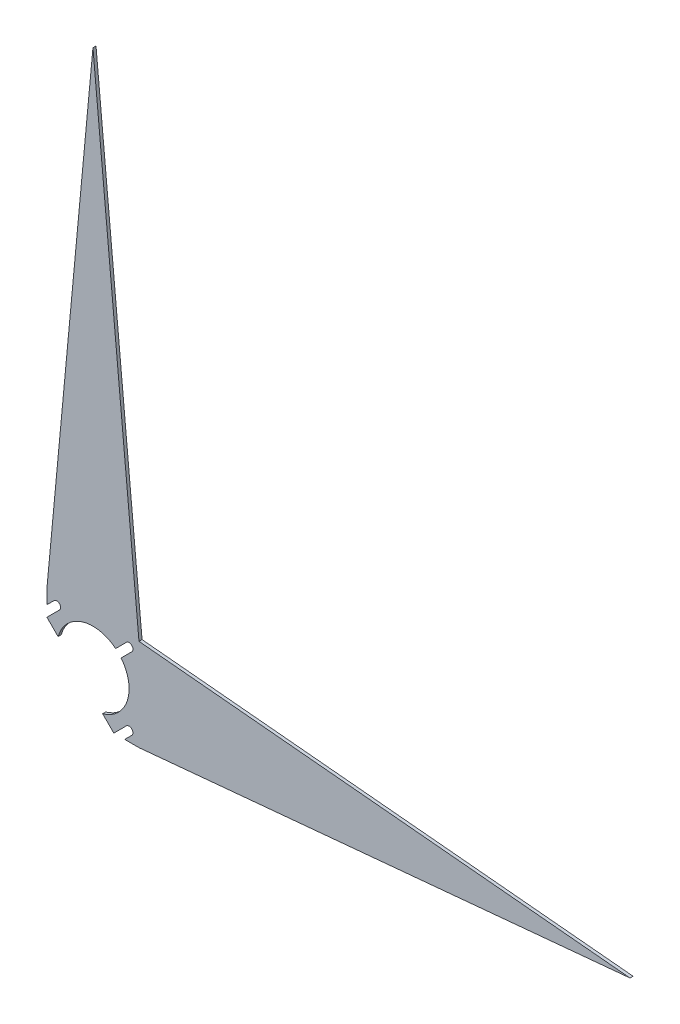
ISO-10303-21;
HEADER;
FILE_DESCRIPTION(('STEP AP214'),'2;1');
FILE_NAME('part.step','',(''),(''),'','','');
FILE_SCHEMA(('AUTOMOTIVE_DESIGN { 1 0 10303 214 1 1 1 1 }'));
ENDSEC;
DATA;
#1=APPLICATION_CONTEXT('core data for automotive mechanical design processes');
#2=APPLICATION_PROTOCOL_DEFINITION('international standard','automotive_design',2000,#1);
#3=PRODUCT_CONTEXT('',#1,'mechanical');
#4=PRODUCT('Part','Part','',(#3));
#5=PRODUCT_RELATED_PRODUCT_CATEGORY('part','',(#4));
#6=PRODUCT_DEFINITION_FORMATION('','',#4);
#7=PRODUCT_DEFINITION_CONTEXT('part definition',#1,'design');
#8=PRODUCT_DEFINITION('design','',#6,#7);
#9=PRODUCT_DEFINITION_SHAPE('','',#8);
#10=(LENGTH_UNIT() NAMED_UNIT(*) SI_UNIT(.MILLI.,.METRE.));
#11=(NAMED_UNIT(*) PLANE_ANGLE_UNIT() SI_UNIT($,.RADIAN.));
#12=(NAMED_UNIT(*) SI_UNIT($,.STERADIAN.) SOLID_ANGLE_UNIT());
#13=UNCERTAINTY_MEASURE_WITH_UNIT(LENGTH_MEASURE(1.E-05),#10,'distance_accuracy_value','');
#14=(GEOMETRIC_REPRESENTATION_CONTEXT(3) GLOBAL_UNCERTAINTY_ASSIGNED_CONTEXT((#13)) GLOBAL_UNIT_ASSIGNED_CONTEXT((#10,
#11,#12)) REPRESENTATION_CONTEXT('',''));
#15=CARTESIAN_POINT('',(0.,0.,0.));
#16=DIRECTION('',(0.,0.,1.));
#17=DIRECTION('',(1.,0.,0.));
#18=AXIS2_PLACEMENT_3D('',#15,#16,#17);
#19=CARTESIAN_POINT('',(23.57,-23.57,2.));
#20=DIRECTION('',(0.,0.,-1.));
#21=DIRECTION('',(-1.,0.,0.));
#22=AXIS2_PLACEMENT_3D('',#19,#20,#21);
#23=CYLINDRICAL_SURFACE('',#22,23.57);
#24=DIRECTION('',(0.,0.,-1.));
#25=VECTOR('',#24,1.);
#26=CARTESIAN_POINT('',(41.9102577132595,-8.76527619267332,2.));
#27=LINE('',#26,#25);
#28=CARTESIAN_POINT('',(41.9102577132595,-8.76527619267332,0.));
#29=VERTEX_POINT('',#28);
#30=CARTESIAN_POINT('',(41.9102577132595,-8.76527619267332,2.));
#31=VERTEX_POINT('',#30);
#32=EDGE_CURVE('E11',#29,#31,#27,.F.);
#33=ORIENTED_EDGE('',*,*,#32,.F.);
#34=CARTESIAN_POINT('',(23.57,-23.57,0.));
#35=DIRECTION('',(0.,0.,1.));
#36=DIRECTION('',(1.,0.,0.));
#37=AXIS2_PLACEMENT_3D('',#34,#35,#36);
#38=CIRCLE('',#37,23.57);
#39=CARTESIAN_POINT('',(29.8832311858542,-46.2787650917869,0.));
#40=VERTEX_POINT('',#39);
#41=EDGE_CURVE('E294',#40,#29,#38,.T.);
#42=ORIENTED_EDGE('',*,*,#41,.F.);
#43=DIRECTION('',(0.,0.,-1.));
#44=VECTOR('',#43,1.);
#45=CARTESIAN_POINT('',(29.8832311858542,-46.2787650917869,2.));
#46=LINE('',#45,#44);
#47=CARTESIAN_POINT('',(29.8832311858542,-46.2787650917869,2.));
#48=VERTEX_POINT('',#47);
#49=EDGE_CURVE('E278',#48,#40,#46,.T.);
#50=ORIENTED_EDGE('',*,*,#49,.F.);
#51=CARTESIAN_POINT('',(23.57,-23.57,2.));
#52=DIRECTION('',(0.,0.,1.));
#53=DIRECTION('',(1.,0.,0.));
#54=AXIS2_PLACEMENT_3D('',#51,#52,#53);
#55=CIRCLE('',#54,23.57);
#56=EDGE_CURVE('E308',#48,#31,#55,.T.);
#57=ORIENTED_EDGE('',*,*,#56,.T.);
#58=EDGE_LOOP('',(#33,#42,#50,#57));
#59=FACE_BOUND('',#58,.T.);
#60=ADVANCED_FACE('F38',(#59),#23,.F.);
#61=CARTESIAN_POINT('',(0.,0.,2.));
#62=DIRECTION('',(0.,0.,1.));
#63=DIRECTION('',(1.,0.,0.));
#64=AXIS2_PLACEMENT_3D('',#61,#62,#63);
#65=PLANE('',#64);
#66=DIRECTION('',(0.707106781186543,0.707106781186552,0.));
#67=VECTOR('',#66,1.);
#68=CARTESIAN_POINT('',(48.9077669529664,-1.76776695296636,2.));
#69=LINE('',#68,#67);
#70=CARTESIAN_POINT('',(48.9077669529664,-1.76776695296636,2.));
#71=VERTEX_POINT('',#70);
#72=EDGE_CURVE('E180',#31,#71,#69,.T.);
#73=ORIENTED_EDGE('',*,*,#72,.F.);
#74=ORIENTED_EDGE('',*,*,#56,.F.);
#75=DIRECTION('',(-0.707106781186547,0.707106781186548,0.));
#76=VECTOR('',#75,1.);
#77=CARTESIAN_POINT('',(-6.42999999999999,-9.96553390593272,2.));
#78=LINE('',#77,#76);
#79=CARTESIAN_POINT('',(37.1744660940673,-53.57,2.));
#80=VERTEX_POINT('',#79);
#81=EDGE_CURVE('E289',#80,#48,#78,.T.);
#82=ORIENTED_EDGE('',*,*,#81,.F.);
#83=DIRECTION('',(-0.707106781186549,-0.707106781186546,0.));
#84=VECTOR('',#83,1.);
#85=CARTESIAN_POINT('',(37.1744660940673,-53.57,2.));
#86=LINE('',#85,#84);
#87=CARTESIAN_POINT('',(45.3722330470337,-45.3722330470336,2.));
#88=VERTEX_POINT('',#87);
#89=EDGE_CURVE('E356',#88,#80,#86,.T.);
#90=ORIENTED_EDGE('',*,*,#89,.F.);
#91=CARTESIAN_POINT('',(47.14,-47.14,2.));
#92=DIRECTION('',(0.,0.,1.));
#93=DIRECTION('',(1.,0.,0.));
#94=AXIS2_PLACEMENT_3D('',#91,#92,#93);
#95=CIRCLE('',#94,2.5);
#96=CARTESIAN_POINT('',(48.9077669529664,-48.9077669529664,2.));
#97=VERTEX_POINT('',#96);
#98=EDGE_CURVE('E197',#97,#88,#95,.T.);
#99=ORIENTED_EDGE('',*,*,#98,.F.);
#100=DIRECTION('',(0.707106781186548,0.707106781186547,0.));
#101=VECTOR('',#100,1.);
#102=CARTESIAN_POINT('',(48.9077669529664,-48.9077669529664,2.));
#103=LINE('',#102,#101);
#104=CARTESIAN_POINT('',(44.2455339059328,-53.57,2.));
#105=VERTEX_POINT('',#104);
#106=EDGE_CURVE('E62',#105,#97,#103,.T.);
#107=ORIENTED_EDGE('',*,*,#106,.F.);
#108=DIRECTION('',(1.,0.,0.));
#109=VECTOR('',#108,1.);
#110=CARTESIAN_POINT('',(-6.42999999999999,-53.57,2.));
#111=LINE('',#110,#109);
#112=CARTESIAN_POINT('',(53.57,-53.57,2.));
#113=VERTEX_POINT('',#112);
#114=EDGE_CURVE('E231',#105,#113,#111,.T.);
#115=ORIENTED_EDGE('',*,*,#114,.T.);
#116=DIRECTION('',(0.995634226059288,0.0933407086930583,0.));
#117=VECTOR('',#116,1.);
#118=CARTESIAN_POINT('',(53.57,-53.57,2.));
#119=LINE('',#118,#117);
#120=CARTESIAN_POINT('',(373.57,-23.57,2.));
#121=VERTEX_POINT('',#120);
#122=EDGE_CURVE('E234',#113,#121,#119,.T.);
#123=ORIENTED_EDGE('',*,*,#122,.T.);
#124=DIRECTION('',(-0.995634226059288,0.0933407086930583,0.));
#125=VECTOR('',#124,1.);
#126=CARTESIAN_POINT('',(373.57,-23.57,2.));
#127=LINE('',#126,#125);
#128=CARTESIAN_POINT('',(53.57,6.43,2.));
#129=VERTEX_POINT('',#128);
#130=EDGE_CURVE('E216',#121,#129,#127,.T.);
#131=ORIENTED_EDGE('',*,*,#130,.T.);
#132=DIRECTION('',(-0.0933407086930583,0.995634226059288,0.));
#133=VECTOR('',#132,1.);
#134=CARTESIAN_POINT('',(53.57,6.43,2.));
#135=LINE('',#134,#133);
#136=CARTESIAN_POINT('',(23.57,326.43,2.));
#137=VERTEX_POINT('',#136);
#138=EDGE_CURVE('E220',#129,#137,#135,.T.);
#139=ORIENTED_EDGE('',*,*,#138,.T.);
#140=DIRECTION('',(-0.0933407086930582,-0.995634226059288,0.));
#141=VECTOR('',#140,1.);
#142=CARTESIAN_POINT('',(23.57,326.43,2.));
#143=LINE('',#142,#141);
#144=CARTESIAN_POINT('',(-6.42999999999999,6.43,2.));
#145=VERTEX_POINT('',#144);
#146=EDGE_CURVE('E224',#137,#145,#143,.T.);
#147=ORIENTED_EDGE('',*,*,#146,.T.);
#148=DIRECTION('',(0.,-1.,0.));
#149=VECTOR('',#148,1.);
#150=CARTESIAN_POINT('',(-6.42999999999999,-53.57,2.));
#151=LINE('',#150,#149);
#152=CARTESIAN_POINT('',(-6.42999999999999,-2.89446609406724,2.));
#153=VERTEX_POINT('',#152);
#154=EDGE_CURVE('E227',#145,#153,#151,.T.);
#155=ORIENTED_EDGE('',*,*,#154,.T.);
#156=DIRECTION('',(-0.707106781186547,-0.707106781186548,0.));
#157=VECTOR('',#156,1.);
#158=CARTESIAN_POINT('',(-1.76776695296637,1.76776695296637,2.));
#159=LINE('',#158,#157);
#160=CARTESIAN_POINT('',(-1.76776695296637,1.76776695296637,2.));
#161=VERTEX_POINT('',#160);
#162=EDGE_CURVE('E351',#161,#153,#159,.T.);
#163=ORIENTED_EDGE('',*,*,#162,.F.);
#164=CARTESIAN_POINT('',(0.,0.,2.));
#165=DIRECTION('',(0.,0.,1.));
#166=DIRECTION('',(1.,0.,0.));
#167=AXIS2_PLACEMENT_3D('',#164,#165,#166);
#168=CIRCLE('',#167,2.5);
#169=CARTESIAN_POINT('',(1.76776695296637,-1.76776695296637,2.));
#170=VERTEX_POINT('',#169);
#171=EDGE_CURVE('E208',#170,#161,#168,.T.);
#172=ORIENTED_EDGE('',*,*,#171,.F.);
#173=DIRECTION('',(0.707106781186548,0.707106781186547,0.));
#174=VECTOR('',#173,1.);
#175=CARTESIAN_POINT('',(-6.42999999999999,-9.96553390593272,2.));
#176=LINE('',#175,#174);
#177=CARTESIAN_POINT('',(-6.42999999999999,-9.96553390593272,2.));
#178=VERTEX_POINT('',#177);
#179=EDGE_CURVE('E336',#178,#170,#176,.T.);
#180=ORIENTED_EDGE('',*,*,#179,.F.);
#181=CARTESIAN_POINT('',(0.861234908213125,-17.2567688141458,2.));
#182=VERTEX_POINT('',#181);
#183=EDGE_CURVE('E360',#182,#178,#78,.T.);
#184=ORIENTED_EDGE('',*,*,#183,.F.);
#185=CARTESIAN_POINT('',(38.3747238073266,-5.22974228674045,2.));
#186=VERTEX_POINT('',#185);
#187=EDGE_CURVE('E314',#186,#182,#55,.T.);
#188=ORIENTED_EDGE('',*,*,#187,.F.);
#189=DIRECTION('',(-0.707106781186556,-0.707106781186539,0.));
#190=VECTOR('',#189,1.);
#191=CARTESIAN_POINT('',(45.3722330470337,1.76776695296639,2.));
#192=LINE('',#191,#190);
#193=CARTESIAN_POINT('',(45.3722330470337,1.76776695296639,2.));
#194=VERTEX_POINT('',#193);
#195=EDGE_CURVE('E329',#194,#186,#192,.T.);
#196=ORIENTED_EDGE('',*,*,#195,.F.);
#197=CARTESIAN_POINT('',(47.14,0.,2.));
#198=DIRECTION('',(0.,0.,1.));
#199=DIRECTION('',(1.,0.,0.));
#200=AXIS2_PLACEMENT_3D('',#197,#198,#199);
#201=CIRCLE('',#200,2.5);
#202=EDGE_CURVE('E189',#71,#194,#201,.T.);
#203=ORIENTED_EDGE('',*,*,#202,.F.);
#204=EDGE_LOOP('',(#73,#74,#82,#90,#99,#107,#115,#123,#131,#139,#147,#155,#163,#172,#180,#184,
#188,#196,#203));
#205=FACE_BOUND('',#204,.T.);
#206=ADVANCED_FACE('F325',(#205),#65,.T.);
#207=CARTESIAN_POINT('',(0.,0.,0.));
#208=DIRECTION('',(0.,0.,1.));
#209=DIRECTION('',(1.,0.,0.));
#210=AXIS2_PLACEMENT_3D('',#207,#208,#209);
#211=PLANE('',#210);
#212=ORIENTED_EDGE('',*,*,#41,.T.);
#213=DIRECTION('',(0.707106781186543,0.707106781186552,0.));
#214=VECTOR('',#213,1.);
#215=CARTESIAN_POINT('',(48.9077669529664,-1.76776695296636,0.));
#216=LINE('',#215,#214);
#217=CARTESIAN_POINT('',(48.9077669529664,-1.76776695296636,0.));
#218=VERTEX_POINT('',#217);
#219=EDGE_CURVE('E179',#29,#218,#216,.T.);
#220=ORIENTED_EDGE('',*,*,#219,.T.);
#221=CARTESIAN_POINT('',(47.14,0.,0.));
#222=DIRECTION('',(0.,0.,1.));
#223=DIRECTION('',(1.,0.,0.));
#224=AXIS2_PLACEMENT_3D('',#221,#222,#223);
#225=CIRCLE('',#224,2.5);
#226=CARTESIAN_POINT('',(45.3722330470337,1.76776695296639,0.));
#227=VERTEX_POINT('',#226);
#228=EDGE_CURVE('E187',#218,#227,#225,.T.);
#229=ORIENTED_EDGE('',*,*,#228,.T.);
#230=DIRECTION('',(-0.707106781186556,-0.707106781186539,0.));
#231=VECTOR('',#230,1.);
#232=CARTESIAN_POINT('',(45.3722330470337,1.76776695296639,0.));
#233=LINE('',#232,#231);
#234=CARTESIAN_POINT('',(38.3747238073266,-5.22974228674045,0.));
#235=VERTEX_POINT('',#234);
#236=EDGE_CURVE('E168',#227,#235,#233,.T.);
#237=ORIENTED_EDGE('',*,*,#236,.T.);
#238=CARTESIAN_POINT('',(0.861234908213125,-17.2567688141458,0.));
#239=VERTEX_POINT('',#238);
#240=EDGE_CURVE('E303',#235,#239,#38,.T.);
#241=ORIENTED_EDGE('',*,*,#240,.T.);
#242=DIRECTION('',(-0.707106781186547,0.707106781186548,0.));
#243=VECTOR('',#242,1.);
#244=CARTESIAN_POINT('',(-6.42999999999999,-9.96553390593272,0.));
#245=LINE('',#244,#243);
#246=CARTESIAN_POINT('',(-6.42999999999999,-9.96553390593272,0.));
#247=VERTEX_POINT('',#246);
#248=EDGE_CURVE('E299',#239,#247,#245,.T.);
#249=ORIENTED_EDGE('',*,*,#248,.T.);
#250=DIRECTION('',(0.707106781186548,0.707106781186547,0.));
#251=VECTOR('',#250,1.);
#252=CARTESIAN_POINT('',(-6.42999999999999,-9.96553390593272,0.));
#253=LINE('',#252,#251);
#254=CARTESIAN_POINT('',(1.76776695296637,-1.76776695296637,0.));
#255=VERTEX_POINT('',#254);
#256=EDGE_CURVE('E338',#247,#255,#253,.T.);
#257=ORIENTED_EDGE('',*,*,#256,.T.);
#258=CARTESIAN_POINT('',(0.,0.,0.));
#259=DIRECTION('',(0.,0.,1.));
#260=DIRECTION('',(1.,0.,0.));
#261=AXIS2_PLACEMENT_3D('',#258,#259,#260);
#262=CIRCLE('',#261,2.5);
#263=CARTESIAN_POINT('',(-1.76776695296637,1.76776695296637,0.));
#264=VERTEX_POINT('',#263);
#265=EDGE_CURVE('E201',#255,#264,#262,.T.);
#266=ORIENTED_EDGE('',*,*,#265,.T.);
#267=DIRECTION('',(-0.707106781186547,-0.707106781186548,0.));
#268=VECTOR('',#267,1.);
#269=CARTESIAN_POINT('',(-1.76776695296637,1.76776695296637,0.));
#270=LINE('',#269,#268);
#271=CARTESIAN_POINT('',(-6.42999999999999,-2.89446609406724,0.));
#272=VERTEX_POINT('',#271);
#273=EDGE_CURVE('E54',#264,#272,#270,.T.);
#274=ORIENTED_EDGE('',*,*,#273,.T.);
#275=DIRECTION('',(0.,-1.,0.));
#276=VECTOR('',#275,1.);
#277=CARTESIAN_POINT('',(-6.42999999999999,-53.57,0.));
#278=LINE('',#277,#276);
#279=CARTESIAN_POINT('',(-6.42999999999999,6.43,0.));
#280=VERTEX_POINT('',#279);
#281=EDGE_CURVE('E247',#280,#272,#278,.T.);
#282=ORIENTED_EDGE('',*,*,#281,.F.);
#283=DIRECTION('',(-0.0933407086930582,-0.995634226059288,0.));
#284=VECTOR('',#283,1.);
#285=CARTESIAN_POINT('',(23.57,326.43,0.));
#286=LINE('',#285,#284);
#287=CARTESIAN_POINT('',(23.57,326.43,0.));
#288=VERTEX_POINT('',#287);
#289=EDGE_CURVE('E244',#288,#280,#286,.T.);
#290=ORIENTED_EDGE('',*,*,#289,.F.);
#291=DIRECTION('',(-0.0933407086930583,0.995634226059288,0.));
#292=VECTOR('',#291,1.);
#293=CARTESIAN_POINT('',(53.57,6.43,0.));
#294=LINE('',#293,#292);
#295=CARTESIAN_POINT('',(53.57,6.43,0.));
#296=VERTEX_POINT('',#295);
#297=EDGE_CURVE('E241',#296,#288,#294,.T.);
#298=ORIENTED_EDGE('',*,*,#297,.F.);
#299=DIRECTION('',(-0.995634226059288,0.0933407086930583,0.));
#300=VECTOR('',#299,1.);
#301=CARTESIAN_POINT('',(373.57,-23.57,0.));
#302=LINE('',#301,#300);
#303=CARTESIAN_POINT('',(373.57,-23.57,0.));
#304=VERTEX_POINT('',#303);
#305=EDGE_CURVE('E212',#304,#296,#302,.T.);
#306=ORIENTED_EDGE('',*,*,#305,.F.);
#307=DIRECTION('',(0.995634226059288,0.0933407086930583,0.));
#308=VECTOR('',#307,1.);
#309=CARTESIAN_POINT('',(53.57,-53.57,0.));
#310=LINE('',#309,#308);
#311=CARTESIAN_POINT('',(53.57,-53.57,0.));
#312=VERTEX_POINT('',#311);
#313=EDGE_CURVE('E221',#312,#304,#310,.T.);
#314=ORIENTED_EDGE('',*,*,#313,.F.);
#315=DIRECTION('',(1.,0.,0.));
#316=VECTOR('',#315,1.);
#317=CARTESIAN_POINT('',(-6.42999999999999,-53.57,0.));
#318=LINE('',#317,#316);
#319=CARTESIAN_POINT('',(44.2455339059328,-53.57,0.));
#320=VERTEX_POINT('',#319);
#321=EDGE_CURVE('E251',#320,#312,#318,.T.);
#322=ORIENTED_EDGE('',*,*,#321,.F.);
#323=DIRECTION('',(0.707106781186548,0.707106781186547,0.));
#324=VECTOR('',#323,1.);
#325=CARTESIAN_POINT('',(48.9077669529664,-48.9077669529664,0.));
#326=LINE('',#325,#324);
#327=CARTESIAN_POINT('',(48.9077669529664,-48.9077669529664,0.));
#328=VERTEX_POINT('',#327);
#329=EDGE_CURVE('E344',#320,#328,#326,.T.);
#330=ORIENTED_EDGE('',*,*,#329,.T.);
#331=CARTESIAN_POINT('',(47.14,-47.14,0.));
#332=DIRECTION('',(0.,0.,1.));
#333=DIRECTION('',(1.,0.,0.));
#334=AXIS2_PLACEMENT_3D('',#331,#332,#333);
#335=CIRCLE('',#334,2.5);
#336=CARTESIAN_POINT('',(45.3722330470337,-45.3722330470336,0.));
#337=VERTEX_POINT('',#336);
#338=EDGE_CURVE('E204',#328,#337,#335,.T.);
#339=ORIENTED_EDGE('',*,*,#338,.T.);
#340=DIRECTION('',(-0.707106781186549,-0.707106781186546,0.));
#341=VECTOR('',#340,1.);
#342=CARTESIAN_POINT('',(37.1744660940673,-53.57,0.));
#343=LINE('',#342,#341);
#344=CARTESIAN_POINT('',(37.1744660940673,-53.57,0.));
#345=VERTEX_POINT('',#344);
#346=EDGE_CURVE('E296',#337,#345,#343,.T.);
#347=ORIENTED_EDGE('',*,*,#346,.T.);
#348=EDGE_CURVE('E286',#345,#40,#245,.T.);
#349=ORIENTED_EDGE('',*,*,#348,.T.);
#350=EDGE_LOOP('',(#212,#220,#229,#237,#241,#249,#257,#266,#274,#282,#290,#298,#306,#314,#322,
#330,#339,#347,#349));
#351=FACE_BOUND('',#350,.T.);
#352=ADVANCED_FACE('F195',(#351),#211,.F.);
#353=CARTESIAN_POINT('',(373.57,-23.57,2.));
#354=DIRECTION('',(-0.0933407086930583,-0.995634226059288,0.));
#355=DIRECTION('',(0.995634226059288,-0.0933407086930583,0.));
#356=AXIS2_PLACEMENT_3D('',#353,#354,#355);
#357=PLANE('',#356);
#358=ORIENTED_EDGE('',*,*,#305,.T.);
#359=DIRECTION('',(0.,0.,-1.));
#360=VECTOR('',#359,1.);
#361=CARTESIAN_POINT('',(53.57,6.43,2.));
#362=LINE('',#361,#360);
#363=EDGE_CURVE('E271',#129,#296,#362,.T.);
#364=ORIENTED_EDGE('',*,*,#363,.F.);
#365=ORIENTED_EDGE('',*,*,#130,.F.);
#366=DIRECTION('',(0.,0.,-1.));
#367=VECTOR('',#366,1.);
#368=CARTESIAN_POINT('',(373.57,-23.57,2.));
#369=LINE('',#368,#367);
#370=EDGE_CURVE('E237',#121,#304,#369,.T.);
#371=ORIENTED_EDGE('',*,*,#370,.T.);
#372=EDGE_LOOP('',(#358,#364,#365,#371));
#373=FACE_BOUND('',#372,.T.);
#374=ADVANCED_FACE('F40',(#373),#357,.F.);
#375=CARTESIAN_POINT('',(53.57,6.43,2.));
#376=DIRECTION('',(-0.995634226059288,-0.0933407086930583,0.));
#377=DIRECTION('',(0.0933407086930583,-0.995634226059288,0.));
#378=AXIS2_PLACEMENT_3D('',#375,#376,#377);
#379=PLANE('',#378);
#380=ORIENTED_EDGE('',*,*,#297,.T.);
#381=DIRECTION('',(0.,0.,-1.));
#382=VECTOR('',#381,1.);
#383=CARTESIAN_POINT('',(23.57,326.43,2.));
#384=LINE('',#383,#382);
#385=EDGE_CURVE('E267',#137,#288,#384,.T.);
#386=ORIENTED_EDGE('',*,*,#385,.F.);
#387=ORIENTED_EDGE('',*,*,#138,.F.);
#388=ORIENTED_EDGE('',*,*,#363,.T.);
#389=EDGE_LOOP('',(#380,#386,#387,#388));
#390=FACE_BOUND('',#389,.T.);
#391=ADVANCED_FACE('F458',(#390),#379,.F.);
#392=CARTESIAN_POINT('',(23.57,326.43,2.));
#393=DIRECTION('',(0.995634226059288,-0.0933407086930583,0.));
#394=DIRECTION('',(0.0933407086930582,0.995634226059288,0.));
#395=AXIS2_PLACEMENT_3D('',#392,#393,#394);
#396=PLANE('',#395);
#397=ORIENTED_EDGE('',*,*,#289,.T.);
#398=DIRECTION('',(0.,0.,-1.));
#399=VECTOR('',#398,1.);
#400=CARTESIAN_POINT('',(-6.42999999999999,6.43,2.));
#401=LINE('',#400,#399);
#402=EDGE_CURVE('E263',#145,#280,#401,.T.);
#403=ORIENTED_EDGE('',*,*,#402,.F.);
#404=ORIENTED_EDGE('',*,*,#146,.F.);
#405=ORIENTED_EDGE('',*,*,#385,.T.);
#406=EDGE_LOOP('',(#397,#403,#404,#405));
#407=FACE_BOUND('',#406,.T.);
#408=ADVANCED_FACE('F455',(#407),#396,.F.);
#409=CARTESIAN_POINT('',(-6.42999999999999,-53.57,2.));
#410=DIRECTION('',(1.,0.,0.));
#411=DIRECTION('',(0.,0.,-1.));
#412=AXIS2_PLACEMENT_3D('',#409,#410,#411);
#413=PLANE('',#412);
#414=ORIENTED_EDGE('',*,*,#281,.T.);
#415=DIRECTION('',(0.,0.,1.));
#416=VECTOR('',#415,1.);
#417=CARTESIAN_POINT('',(-6.42999999999999,-2.89446609406725,2.));
#418=LINE('',#417,#416);
#419=EDGE_CURVE('E304',#272,#153,#418,.T.);
#420=ORIENTED_EDGE('',*,*,#419,.T.);
#421=ORIENTED_EDGE('',*,*,#154,.F.);
#422=ORIENTED_EDGE('',*,*,#402,.T.);
#423=EDGE_LOOP('',(#414,#420,#421,#422));
#424=FACE_BOUND('',#423,.T.);
#425=ADVANCED_FACE('F450',(#424),#413,.F.);
#426=CARTESIAN_POINT('',(-6.42999999999999,-53.57,2.));
#427=DIRECTION('',(0.,1.,0.));
#428=DIRECTION('',(0.,0.,1.));
#429=AXIS2_PLACEMENT_3D('',#426,#427,#428);
#430=PLANE('',#429);
#431=ORIENTED_EDGE('',*,*,#114,.F.);
#432=DIRECTION('',(0.,0.,-1.));
#433=VECTOR('',#432,1.);
#434=CARTESIAN_POINT('',(44.2455339059327,-53.57,2.));
#435=LINE('',#434,#433);
#436=EDGE_CURVE('E310',#105,#320,#435,.T.);
#437=ORIENTED_EDGE('',*,*,#436,.T.);
#438=ORIENTED_EDGE('',*,*,#321,.T.);
#439=DIRECTION('',(0.,0.,-1.));
#440=VECTOR('',#439,1.);
#441=CARTESIAN_POINT('',(53.57,-53.57,2.));
#442=LINE('',#441,#440);
#443=EDGE_CURVE('E259',#113,#312,#442,.T.);
#444=ORIENTED_EDGE('',*,*,#443,.F.);
#445=EDGE_LOOP('',(#431,#437,#438,#444));
#446=FACE_BOUND('',#445,.T.);
#447=ADVANCED_FACE('F387',(#446),#430,.F.);
#448=CARTESIAN_POINT('',(53.57,-53.57,2.));
#449=DIRECTION('',(-0.0933407086930583,0.995634226059288,0.));
#450=DIRECTION('',(-0.995634226059288,-0.0933407086930583,0.));
#451=AXIS2_PLACEMENT_3D('',#448,#449,#450);
#452=PLANE('',#451);
#453=ORIENTED_EDGE('',*,*,#313,.T.);
#454=ORIENTED_EDGE('',*,*,#370,.F.);
#455=ORIENTED_EDGE('',*,*,#122,.F.);
#456=ORIENTED_EDGE('',*,*,#443,.T.);
#457=EDGE_LOOP('',(#453,#454,#455,#456));
#458=FACE_BOUND('',#457,.T.);
#459=ADVANCED_FACE('F393',(#458),#452,.F.);
#460=CARTESIAN_POINT('',(0.,0.,2.));
#461=DIRECTION('',(0.,0.,-1.));
#462=DIRECTION('',(-1.,0.,0.));
#463=AXIS2_PLACEMENT_3D('',#460,#461,#462);
#464=CYLINDRICAL_SURFACE('',#463,2.5);
#465=DIRECTION('',(0.,0.,1.));
#466=VECTOR('',#465,1.);
#467=CARTESIAN_POINT('',(1.76776695296637,-1.76776695296637,0.));
#468=LINE('',#467,#466);
#469=EDGE_CURVE('E298',#255,#170,#468,.T.);
#470=ORIENTED_EDGE('',*,*,#469,.T.);
#471=ORIENTED_EDGE('',*,*,#171,.T.);
#472=DIRECTION('',(0.,0.,1.));
#473=VECTOR('',#472,1.);
#474=CARTESIAN_POINT('',(-1.76776695296637,1.76776695296637,0.));
#475=LINE('',#474,#473);
#476=EDGE_CURVE('E376',#264,#161,#475,.T.);
#477=ORIENTED_EDGE('',*,*,#476,.F.);
#478=ORIENTED_EDGE('',*,*,#265,.F.);
#479=EDGE_LOOP('',(#470,#471,#477,#478));
#480=FACE_BOUND('',#479,.T.);
#481=ADVANCED_FACE('F446',(#480),#464,.F.);
#482=CARTESIAN_POINT('',(47.14,0.,2.));
#483=DIRECTION('',(0.,0.,-1.));
#484=DIRECTION('',(-1.,0.,0.));
#485=AXIS2_PLACEMENT_3D('',#482,#483,#484);
#486=CYLINDRICAL_SURFACE('',#485,2.5);
#487=DIRECTION('',(0.,0.,1.));
#488=VECTOR('',#487,1.);
#489=CARTESIAN_POINT('',(48.9077669529664,-1.76776695296636,0.));
#490=LINE('',#489,#488);
#491=EDGE_CURVE('E191',#218,#71,#490,.T.);
#492=ORIENTED_EDGE('',*,*,#491,.T.);
#493=ORIENTED_EDGE('',*,*,#202,.T.);
#494=DIRECTION('',(0.,0.,1.));
#495=VECTOR('',#494,1.);
#496=CARTESIAN_POINT('',(45.3722330470337,1.76776695296639,0.));
#497=LINE('',#496,#495);
#498=EDGE_CURVE('E171',#227,#194,#497,.T.);
#499=ORIENTED_EDGE('',*,*,#498,.F.);
#500=ORIENTED_EDGE('',*,*,#228,.F.);
#501=EDGE_LOOP('',(#492,#493,#499,#500));
#502=FACE_BOUND('',#501,.T.);
#503=ADVANCED_FACE('F186',(#502),#486,.F.);
#504=CARTESIAN_POINT('',(47.14,-47.14,2.));
#505=DIRECTION('',(0.,0.,-1.));
#506=DIRECTION('',(-1.,0.,0.));
#507=AXIS2_PLACEMENT_3D('',#504,#505,#506);
#508=CYLINDRICAL_SURFACE('',#507,2.5);
#509=DIRECTION('',(0.,0.,1.));
#510=VECTOR('',#509,1.);
#511=CARTESIAN_POINT('',(45.3722330470337,-45.3722330470336,0.));
#512=LINE('',#511,#510);
#513=EDGE_CURVE('E370',#337,#88,#512,.T.);
#514=ORIENTED_EDGE('',*,*,#513,.F.);
#515=ORIENTED_EDGE('',*,*,#338,.F.);
#516=DIRECTION('',(0.,0.,1.));
#517=VECTOR('',#516,1.);
#518=CARTESIAN_POINT('',(48.9077669529664,-48.9077669529664,0.));
#519=LINE('',#518,#517);
#520=EDGE_CURVE('E373',#328,#97,#519,.T.);
#521=ORIENTED_EDGE('',*,*,#520,.T.);
#522=ORIENTED_EDGE('',*,*,#98,.T.);
#523=EDGE_LOOP('',(#514,#515,#521,#522));
#524=FACE_BOUND('',#523,.T.);
#525=ADVANCED_FACE('F402',(#524),#508,.F.);
#526=DIRECTION('',(0.,0.,-1.));
#527=VECTOR('',#526,1.);
#528=CARTESIAN_POINT('',(38.3747238073266,-5.22974228674045,2.));
#529=LINE('',#528,#527);
#530=EDGE_CURVE('E47',#186,#235,#529,.T.);
#531=ORIENTED_EDGE('',*,*,#530,.F.);
#532=ORIENTED_EDGE('',*,*,#187,.T.);
#533=DIRECTION('',(0.,0.,-1.));
#534=VECTOR('',#533,1.);
#535=CARTESIAN_POINT('',(0.861234908213127,-17.2567688141458,2.));
#536=LINE('',#535,#534);
#537=EDGE_CURVE('E275',#239,#182,#536,.F.);
#538=ORIENTED_EDGE('',*,*,#537,.F.);
#539=ORIENTED_EDGE('',*,*,#240,.F.);
#540=EDGE_LOOP('',(#531,#532,#538,#539));
#541=FACE_BOUND('',#540,.T.);
#542=ADVANCED_FACE('F417',(#541),#23,.F.);
#543=CARTESIAN_POINT('',(-6.42999999999999,-9.96553390593272,0.));
#544=DIRECTION('',(0.707106781186548,0.707106781186547,0.));
#545=DIRECTION('',(-0.707106781186547,0.707106781186548,0.));
#546=AXIS2_PLACEMENT_3D('',#543,#544,#545);
#547=PLANE('',#546);
#548=ORIENTED_EDGE('',*,*,#537,.T.);
#549=ORIENTED_EDGE('',*,*,#183,.T.);
#550=DIRECTION('',(0.,0.,1.));
#551=VECTOR('',#550,1.);
#552=CARTESIAN_POINT('',(-6.42999999999999,-9.96553390593272,0.));
#553=LINE('',#552,#551);
#554=EDGE_CURVE('E363',#247,#178,#553,.T.);
#555=ORIENTED_EDGE('',*,*,#554,.F.);
#556=ORIENTED_EDGE('',*,*,#248,.F.);
#557=EDGE_LOOP('',(#548,#549,#555,#556));
#558=FACE_BOUND('',#557,.T.);
#559=ADVANCED_FACE('F426',(#558),#547,.F.);
#560=CARTESIAN_POINT('',(-6.42999999999999,-9.96553390593272,0.));
#561=DIRECTION('',(0.707106781186547,-0.707106781186548,0.));
#562=DIRECTION('',(0.707106781186548,0.707106781186547,0.));
#563=AXIS2_PLACEMENT_3D('',#560,#561,#562);
#564=PLANE('',#563);
#565=ORIENTED_EDGE('',*,*,#179,.T.);
#566=ORIENTED_EDGE('',*,*,#469,.F.);
#567=ORIENTED_EDGE('',*,*,#256,.F.);
#568=ORIENTED_EDGE('',*,*,#554,.T.);
#569=EDGE_LOOP('',(#565,#566,#567,#568));
#570=FACE_BOUND('',#569,.T.);
#571=ADVANCED_FACE('F432',(#570),#564,.F.);
#572=ORIENTED_EDGE('',*,*,#49,.T.);
#573=ORIENTED_EDGE('',*,*,#348,.F.);
#574=DIRECTION('',(0.,0.,1.));
#575=VECTOR('',#574,1.);
#576=CARTESIAN_POINT('',(37.1744660940673,-53.57,0.));
#577=LINE('',#576,#575);
#578=EDGE_CURVE('E367',#345,#80,#577,.T.);
#579=ORIENTED_EDGE('',*,*,#578,.T.);
#580=ORIENTED_EDGE('',*,*,#81,.T.);
#581=EDGE_LOOP('',(#572,#573,#579,#580));
#582=FACE_BOUND('',#581,.T.);
#583=ADVANCED_FACE('F285',(#582),#547,.F.);
#584=CARTESIAN_POINT('',(37.1744660940673,-53.57,0.));
#585=DIRECTION('',(-0.707106781186546,0.707106781186549,0.));
#586=DIRECTION('',(-0.707106781186549,-0.707106781186546,0.));
#587=AXIS2_PLACEMENT_3D('',#584,#585,#586);
#588=PLANE('',#587);
#589=ORIENTED_EDGE('',*,*,#89,.T.);
#590=ORIENTED_EDGE('',*,*,#578,.F.);
#591=ORIENTED_EDGE('',*,*,#346,.F.);
#592=ORIENTED_EDGE('',*,*,#513,.T.);
#593=EDGE_LOOP('',(#589,#590,#591,#592));
#594=FACE_BOUND('',#593,.T.);
#595=ADVANCED_FACE('F509',(#594),#588,.F.);
#596=CARTESIAN_POINT('',(45.3722330470337,1.76776695296639,0.));
#597=DIRECTION('',(-0.707106781186539,0.707106781186556,0.));
#598=DIRECTION('',(-0.707106781186556,-0.707106781186539,0.));
#599=AXIS2_PLACEMENT_3D('',#596,#597,#598);
#600=PLANE('',#599);
#601=ORIENTED_EDGE('',*,*,#530,.T.);
#602=ORIENTED_EDGE('',*,*,#236,.F.);
#603=ORIENTED_EDGE('',*,*,#498,.T.);
#604=ORIENTED_EDGE('',*,*,#195,.T.);
#605=EDGE_LOOP('',(#601,#602,#603,#604));
#606=FACE_BOUND('',#605,.T.);
#607=ADVANCED_FACE('F170',(#606),#600,.F.);
#608=CARTESIAN_POINT('',(48.9077669529664,-1.76776695296636,0.));
#609=DIRECTION('',(0.707106781186552,-0.707106781186543,0.));
#610=DIRECTION('',(0.707106781186543,0.707106781186552,0.));
#611=AXIS2_PLACEMENT_3D('',#608,#609,#610);
#612=PLANE('',#611);
#613=ORIENTED_EDGE('',*,*,#32,.T.);
#614=ORIENTED_EDGE('',*,*,#72,.T.);
#615=ORIENTED_EDGE('',*,*,#491,.F.);
#616=ORIENTED_EDGE('',*,*,#219,.F.);
#617=EDGE_LOOP('',(#613,#614,#615,#616));
#618=FACE_BOUND('',#617,.T.);
#619=ADVANCED_FACE('F406',(#618),#612,.F.);
#620=CARTESIAN_POINT('',(48.9077669529664,-48.9077669529664,0.));
#621=DIRECTION('',(0.707106781186547,-0.707106781186548,0.));
#622=DIRECTION('',(0.707106781186548,0.707106781186547,0.));
#623=AXIS2_PLACEMENT_3D('',#620,#621,#622);
#624=PLANE('',#623);
#625=ORIENTED_EDGE('',*,*,#106,.T.);
#626=ORIENTED_EDGE('',*,*,#520,.F.);
#627=ORIENTED_EDGE('',*,*,#329,.F.);
#628=ORIENTED_EDGE('',*,*,#436,.F.);
#629=EDGE_LOOP('',(#625,#626,#627,#628));
#630=FACE_BOUND('',#629,.T.);
#631=ADVANCED_FACE('F403',(#630),#624,.F.);
#632=CARTESIAN_POINT('',(-1.76776695296637,1.76776695296637,0.));
#633=DIRECTION('',(-0.707106781186548,0.707106781186547,0.));
#634=DIRECTION('',(-0.707106781186547,-0.707106781186548,0.));
#635=AXIS2_PLACEMENT_3D('',#632,#633,#634);
#636=PLANE('',#635);
#637=ORIENTED_EDGE('',*,*,#273,.F.);
#638=ORIENTED_EDGE('',*,*,#476,.T.);
#639=ORIENTED_EDGE('',*,*,#162,.T.);
#640=ORIENTED_EDGE('',*,*,#419,.F.);
#641=EDGE_LOOP('',(#637,#638,#639,#640));
#642=FACE_BOUND('',#641,.T.);
#643=ADVANCED_FACE('F405',(#642),#636,.F.);
#644=CLOSED_SHELL('',(#60,#206,#352,#374,#391,#408,#425,#447,#459,#481,#503,#525,#542,#559,#571,
#583,#595,#607,#619,#631,#643));
#645=MANIFOLD_SOLID_BREP('B2',#644);
#646=ADVANCED_BREP_SHAPE_REPRESENTATION('',(#18,#645),#14);
#647=SHAPE_DEFINITION_REPRESENTATION(#9,#646);
ENDSEC;
END-ISO-10303-21;
